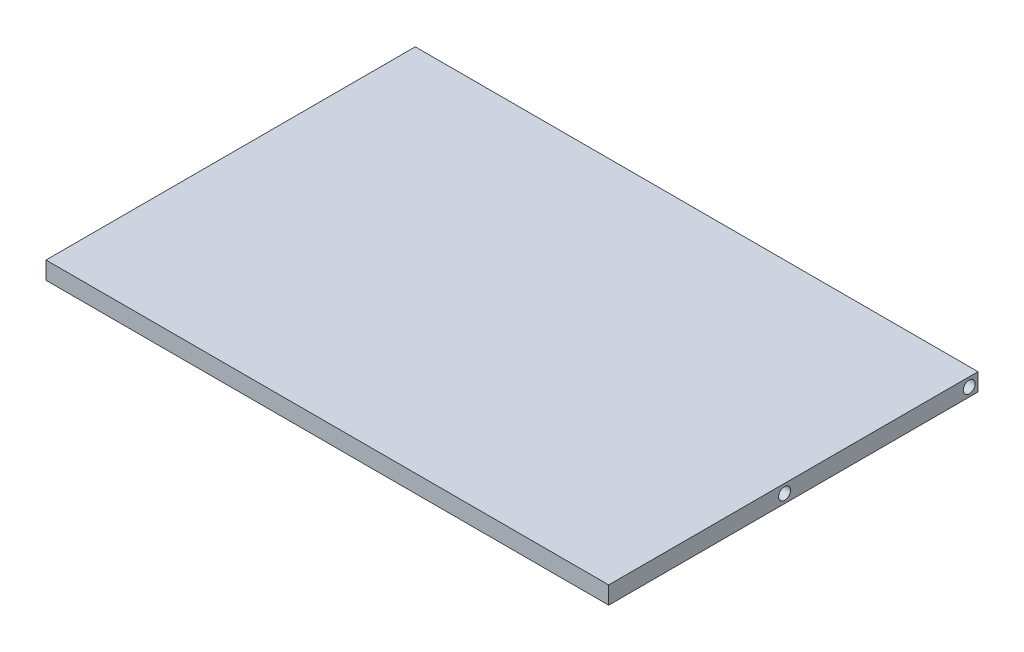
ISO-10303-21;
HEADER;
FILE_DESCRIPTION(('STEP AP214'),'2;1');
FILE_NAME('part.step','',(''),(''),'','','');
FILE_SCHEMA(('AUTOMOTIVE_DESIGN { 1 0 10303 214 1 1 1 1 }'));
ENDSEC;
DATA;
#1=APPLICATION_CONTEXT('core data for automotive mechanical design processes');
#2=APPLICATION_PROTOCOL_DEFINITION('international standard','automotive_design',2000,#1);
#3=PRODUCT_CONTEXT('',#1,'mechanical');
#4=PRODUCT('Part','Part','',(#3));
#5=PRODUCT_RELATED_PRODUCT_CATEGORY('part','',(#4));
#6=PRODUCT_DEFINITION_FORMATION('','',#4);
#7=PRODUCT_DEFINITION_CONTEXT('part definition',#1,'design');
#8=PRODUCT_DEFINITION('design','',#6,#7);
#9=PRODUCT_DEFINITION_SHAPE('','',#8);
#10=(LENGTH_UNIT() NAMED_UNIT(*) SI_UNIT(.MILLI.,.METRE.));
#11=(NAMED_UNIT(*) PLANE_ANGLE_UNIT() SI_UNIT($,.RADIAN.));
#12=(NAMED_UNIT(*) SI_UNIT($,.STERADIAN.) SOLID_ANGLE_UNIT());
#13=UNCERTAINTY_MEASURE_WITH_UNIT(LENGTH_MEASURE(1.E-05),#10,'distance_accuracy_value','');
#14=(GEOMETRIC_REPRESENTATION_CONTEXT(3) GLOBAL_UNCERTAINTY_ASSIGNED_CONTEXT((#13)) GLOBAL_UNIT_ASSIGNED_CONTEXT((#10,
#11,#12)) REPRESENTATION_CONTEXT('',''));
#15=CARTESIAN_POINT('',(0.,0.,0.));
#16=DIRECTION('',(0.,0.,1.));
#17=DIRECTION('',(1.,0.,0.));
#18=AXIS2_PLACEMENT_3D('',#15,#16,#17);
#19=CARTESIAN_POINT('',(80.,5.,-52.5));
#20=DIRECTION('',(-1.,0.,0.));
#21=DIRECTION('',(0.,0.,1.));
#22=AXIS2_PLACEMENT_3D('',#19,#20,#21);
#23=PLANE('',#22);
#24=CARTESIAN_POINT('',(80.,2.5,-50.));
#25=DIRECTION('',(1.,0.,0.));
#26=DIRECTION('',(0.,0.,-1.));
#27=AXIS2_PLACEMENT_3D('',#24,#25,#26);
#28=CIRCLE('',#27,1.7);
#29=CARTESIAN_POINT('',(80.,2.5,-51.7));
#30=VERTEX_POINT('',#29);
#31=EDGE_CURVE('E140',#30,#30,#28,.T.);
#32=ORIENTED_EDGE('',*,*,#31,.F.);
#33=EDGE_LOOP('',(#32));
#34=FACE_BOUND('',#33,.T.);
#35=CARTESIAN_POINT('',(80.,2.5,2.5));
#36=DIRECTION('',(1.,0.,0.));
#37=DIRECTION('',(0.,0.,-1.));
#38=AXIS2_PLACEMENT_3D('',#35,#36,#37);
#39=CIRCLE('',#38,1.7);
#40=CARTESIAN_POINT('',(80.,2.5,0.8));
#41=VERTEX_POINT('',#40);
#42=EDGE_CURVE('E130',#41,#41,#39,.T.);
#43=ORIENTED_EDGE('',*,*,#42,.F.);
#44=EDGE_LOOP('',(#43));
#45=FACE_BOUND('',#44,.T.);
#46=DIRECTION('',(0.,0.,-1.));
#47=VECTOR('',#46,1.);
#48=CARTESIAN_POINT('',(80.,0.,-52.5));
#49=LINE('',#48,#47);
#50=CARTESIAN_POINT('',(80.,0.,52.5));
#51=VERTEX_POINT('',#50);
#52=CARTESIAN_POINT('',(80.,0.,-52.5));
#53=VERTEX_POINT('',#52);
#54=EDGE_CURVE('E114',#51,#53,#49,.T.);
#55=ORIENTED_EDGE('',*,*,#54,.T.);
#56=DIRECTION('',(0.,-1.,0.));
#57=VECTOR('',#56,1.);
#58=CARTESIAN_POINT('',(80.,5.,-52.5));
#59=LINE('',#58,#57);
#60=CARTESIAN_POINT('',(80.,5.,-52.5));
#61=VERTEX_POINT('',#60);
#62=EDGE_CURVE('E11',#61,#53,#59,.T.);
#63=ORIENTED_EDGE('',*,*,#62,.F.);
#64=DIRECTION('',(0.,0.,-1.));
#65=VECTOR('',#64,1.);
#66=CARTESIAN_POINT('',(80.,5.,-52.5));
#67=LINE('',#66,#65);
#68=CARTESIAN_POINT('',(80.,5.,52.5));
#69=VERTEX_POINT('',#68);
#70=EDGE_CURVE('E97',#69,#61,#67,.T.);
#71=ORIENTED_EDGE('',*,*,#70,.F.);
#72=DIRECTION('',(0.,-1.,0.));
#73=VECTOR('',#72,1.);
#74=CARTESIAN_POINT('',(80.,5.,52.5));
#75=LINE('',#74,#73);
#76=EDGE_CURVE('E110',#69,#51,#75,.T.);
#77=ORIENTED_EDGE('',*,*,#76,.T.);
#78=EDGE_LOOP('',(#55,#63,#71,#77));
#79=FACE_BOUND('',#78,.T.);
#80=ADVANCED_FACE('F43',(#34,#45,#79),#23,.F.);
#81=CARTESIAN_POINT('',(-80.,5.,-52.5));
#82=DIRECTION('',(0.,0.,1.));
#83=DIRECTION('',(1.,0.,0.));
#84=AXIS2_PLACEMENT_3D('',#81,#82,#83);
#85=PLANE('',#84);
#86=DIRECTION('',(-1.,0.,0.));
#87=VECTOR('',#86,1.);
#88=CARTESIAN_POINT('',(-80.,0.,-52.5));
#89=LINE('',#88,#87);
#90=CARTESIAN_POINT('',(-80.,0.,-52.5));
#91=VERTEX_POINT('',#90);
#92=EDGE_CURVE('E102',#53,#91,#89,.T.);
#93=ORIENTED_EDGE('',*,*,#92,.T.);
#94=DIRECTION('',(0.,-1.,0.));
#95=VECTOR('',#94,1.);
#96=CARTESIAN_POINT('',(-80.,5.,-52.5));
#97=LINE('',#96,#95);
#98=CARTESIAN_POINT('',(-80.,5.,-52.5));
#99=VERTEX_POINT('',#98);
#100=EDGE_CURVE('E53',#99,#91,#97,.T.);
#101=ORIENTED_EDGE('',*,*,#100,.F.);
#102=DIRECTION('',(-1.,0.,0.));
#103=VECTOR('',#102,1.);
#104=CARTESIAN_POINT('',(-80.,5.,-52.5));
#105=LINE('',#104,#103);
#106=EDGE_CURVE('E92',#61,#99,#105,.T.);
#107=ORIENTED_EDGE('',*,*,#106,.F.);
#108=ORIENTED_EDGE('',*,*,#62,.T.);
#109=EDGE_LOOP('',(#93,#101,#107,#108));
#110=FACE_BOUND('',#109,.T.);
#111=ADVANCED_FACE('F101',(#110),#85,.F.);
#112=CARTESIAN_POINT('',(-80.,5.,-52.5));
#113=DIRECTION('',(1.,0.,0.));
#114=DIRECTION('',(0.,0.,-1.));
#115=AXIS2_PLACEMENT_3D('',#112,#113,#114);
#116=PLANE('',#115);
#117=CARTESIAN_POINT('',(-80.,2.5,-50.));
#118=DIRECTION('',(1.,0.,0.));
#119=DIRECTION('',(0.,0.,-1.));
#120=AXIS2_PLACEMENT_3D('',#117,#118,#119);
#121=CIRCLE('',#120,1.7);
#122=CARTESIAN_POINT('',(-80.,2.5,-51.7));
#123=VERTEX_POINT('',#122);
#124=EDGE_CURVE('E46',#123,#123,#121,.T.);
#125=ORIENTED_EDGE('',*,*,#124,.T.);
#126=EDGE_LOOP('',(#125));
#127=FACE_BOUND('',#126,.T.);
#128=CARTESIAN_POINT('',(-80.,2.5,2.5));
#129=DIRECTION('',(1.,0.,0.));
#130=DIRECTION('',(0.,0.,-1.));
#131=AXIS2_PLACEMENT_3D('',#128,#129,#130);
#132=CIRCLE('',#131,1.7);
#133=CARTESIAN_POINT('',(-80.,2.5,0.8));
#134=VERTEX_POINT('',#133);
#135=EDGE_CURVE('E118',#134,#134,#132,.T.);
#136=ORIENTED_EDGE('',*,*,#135,.T.);
#137=EDGE_LOOP('',(#136));
#138=FACE_BOUND('',#137,.T.);
#139=DIRECTION('',(0.,0.,1.));
#140=VECTOR('',#139,1.);
#141=CARTESIAN_POINT('',(-80.,0.,-52.5));
#142=LINE('',#141,#140);
#143=CARTESIAN_POINT('',(-80.,0.,52.5));
#144=VERTEX_POINT('',#143);
#145=EDGE_CURVE('E79',#91,#144,#142,.T.);
#146=ORIENTED_EDGE('',*,*,#145,.T.);
#147=DIRECTION('',(0.,-1.,0.));
#148=VECTOR('',#147,1.);
#149=CARTESIAN_POINT('',(-80.,5.,52.5));
#150=LINE('',#149,#148);
#151=CARTESIAN_POINT('',(-80.,5.,52.5));
#152=VERTEX_POINT('',#151);
#153=EDGE_CURVE('E104',#152,#144,#150,.T.);
#154=ORIENTED_EDGE('',*,*,#153,.F.);
#155=DIRECTION('',(0.,0.,1.));
#156=VECTOR('',#155,1.);
#157=CARTESIAN_POINT('',(-80.,5.,-52.5));
#158=LINE('',#157,#156);
#159=EDGE_CURVE('E95',#99,#152,#158,.T.);
#160=ORIENTED_EDGE('',*,*,#159,.F.);
#161=ORIENTED_EDGE('',*,*,#100,.T.);
#162=EDGE_LOOP('',(#146,#154,#160,#161));
#163=FACE_BOUND('',#162,.T.);
#164=ADVANCED_FACE('F106',(#127,#138,#163),#116,.F.);
#165=CARTESIAN_POINT('',(-80.,5.,52.5));
#166=DIRECTION('',(0.,0.,-1.));
#167=DIRECTION('',(-1.,0.,0.));
#168=AXIS2_PLACEMENT_3D('',#165,#166,#167);
#169=PLANE('',#168);
#170=DIRECTION('',(1.,0.,0.));
#171=VECTOR('',#170,1.);
#172=CARTESIAN_POINT('',(-80.,0.,52.5));
#173=LINE('',#172,#171);
#174=EDGE_CURVE('E85',#144,#51,#173,.T.);
#175=ORIENTED_EDGE('',*,*,#174,.T.);
#176=ORIENTED_EDGE('',*,*,#76,.F.);
#177=DIRECTION('',(1.,0.,0.));
#178=VECTOR('',#177,1.);
#179=CARTESIAN_POINT('',(-80.,5.,52.5));
#180=LINE('',#179,#178);
#181=EDGE_CURVE('E62',#152,#69,#180,.T.);
#182=ORIENTED_EDGE('',*,*,#181,.F.);
#183=ORIENTED_EDGE('',*,*,#153,.T.);
#184=EDGE_LOOP('',(#175,#176,#182,#183));
#185=FACE_BOUND('',#184,.T.);
#186=ADVANCED_FACE('F164',(#185),#169,.F.);
#187=CARTESIAN_POINT('',(0.,5.,0.));
#188=DIRECTION('',(0.,1.,0.));
#189=DIRECTION('',(0.,0.,1.));
#190=AXIS2_PLACEMENT_3D('',#187,#188,#189);
#191=PLANE('',#190);
#192=ORIENTED_EDGE('',*,*,#70,.T.);
#193=ORIENTED_EDGE('',*,*,#106,.T.);
#194=ORIENTED_EDGE('',*,*,#159,.T.);
#195=ORIENTED_EDGE('',*,*,#181,.T.);
#196=EDGE_LOOP('',(#192,#193,#194,#195));
#197=FACE_BOUND('',#196,.T.);
#198=ADVANCED_FACE('F93',(#197),#191,.T.);
#199=CARTESIAN_POINT('',(0.,0.,0.));
#200=DIRECTION('',(0.,1.,0.));
#201=DIRECTION('',(0.,0.,1.));
#202=AXIS2_PLACEMENT_3D('',#199,#200,#201);
#203=PLANE('',#202);
#204=ORIENTED_EDGE('',*,*,#54,.F.);
#205=ORIENTED_EDGE('',*,*,#174,.F.);
#206=ORIENTED_EDGE('',*,*,#145,.F.);
#207=ORIENTED_EDGE('',*,*,#92,.F.);
#208=EDGE_LOOP('',(#204,#205,#206,#207));
#209=FACE_BOUND('',#208,.T.);
#210=ADVANCED_FACE('F155',(#209),#203,.F.);
#211=CARTESIAN_POINT('',(-120.,2.5,2.5));
#212=DIRECTION('',(1.,0.,0.));
#213=DIRECTION('',(0.,0.,-1.));
#214=AXIS2_PLACEMENT_3D('',#211,#212,#213);
#215=CYLINDRICAL_SURFACE('',#214,1.7);
#216=ORIENTED_EDGE('',*,*,#42,.T.);
#217=EDGE_LOOP('',(#216));
#218=FACE_BOUND('',#217,.T.);
#219=ORIENTED_EDGE('',*,*,#135,.F.);
#220=EDGE_LOOP('',(#219));
#221=FACE_BOUND('',#220,.T.);
#222=ADVANCED_FACE('F157',(#218,#221),#215,.F.);
#223=CARTESIAN_POINT('',(-120.,2.5,-50.));
#224=DIRECTION('',(1.,0.,0.));
#225=DIRECTION('',(0.,0.,-1.));
#226=AXIS2_PLACEMENT_3D('',#223,#224,#225);
#227=CYLINDRICAL_SURFACE('',#226,1.7);
#228=ORIENTED_EDGE('',*,*,#31,.T.);
#229=EDGE_LOOP('',(#228));
#230=FACE_BOUND('',#229,.T.);
#231=ORIENTED_EDGE('',*,*,#124,.F.);
#232=EDGE_LOOP('',(#231));
#233=FACE_BOUND('',#232,.T.);
#234=ADVANCED_FACE('F147',(#230,#233),#227,.F.);
#235=CLOSED_SHELL('',(#80,#111,#164,#186,#198,#210,#222,#234));
#236=MANIFOLD_SOLID_BREP('B2',#235);
#237=ADVANCED_BREP_SHAPE_REPRESENTATION('',(#18,#236),#14);
#238=SHAPE_DEFINITION_REPRESENTATION(#9,#237);
ENDSEC;
END-ISO-10303-21;
